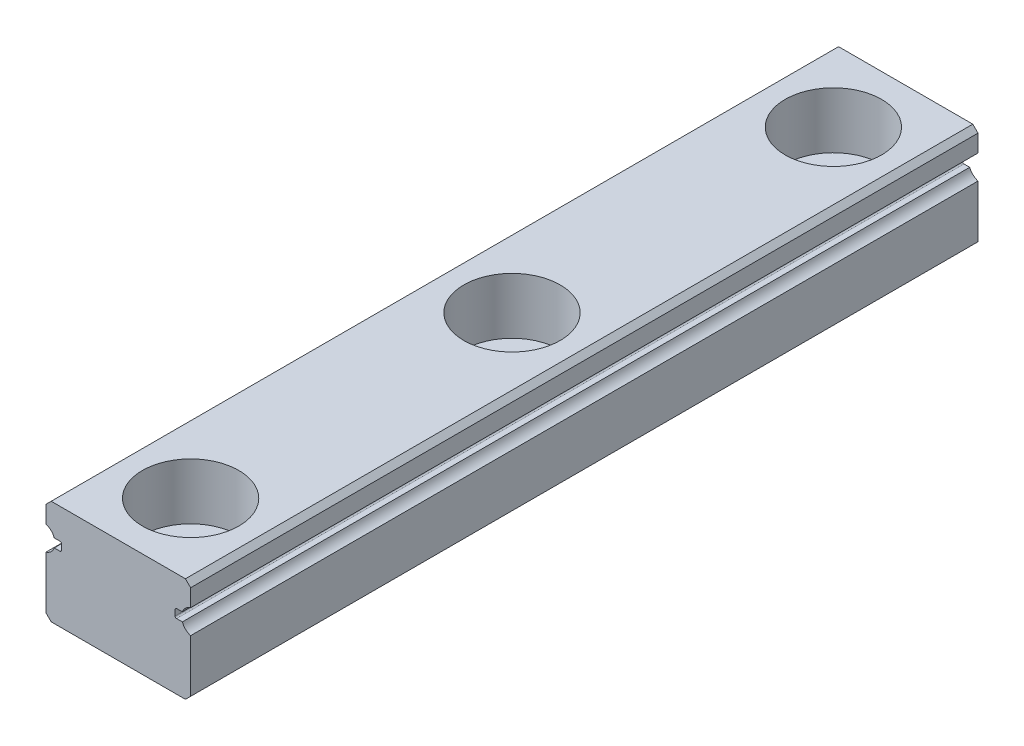
ISO-10303-21;
HEADER;
FILE_DESCRIPTION(('STEP AP214'),'2;1');
FILE_NAME('part.step','',(''),(''),'','','');
FILE_SCHEMA(('AUTOMOTIVE_DESIGN { 1 0 10303 214 1 1 1 1 }'));
ENDSEC;
DATA;
#1=APPLICATION_CONTEXT('core data for automotive mechanical design processes');
#2=APPLICATION_PROTOCOL_DEFINITION('international standard','automotive_design',2000,#1);
#3=PRODUCT_CONTEXT('',#1,'mechanical');
#4=PRODUCT('Part','Part','',(#3));
#5=PRODUCT_RELATED_PRODUCT_CATEGORY('part','',(#4));
#6=PRODUCT_DEFINITION_FORMATION('','',#4);
#7=PRODUCT_DEFINITION_CONTEXT('part definition',#1,'design');
#8=PRODUCT_DEFINITION('design','',#6,#7);
#9=PRODUCT_DEFINITION_SHAPE('','',#8);
#10=(LENGTH_UNIT() NAMED_UNIT(*) SI_UNIT(.MILLI.,.METRE.));
#11=(NAMED_UNIT(*) PLANE_ANGLE_UNIT() SI_UNIT($,.RADIAN.));
#12=(NAMED_UNIT(*) SI_UNIT($,.STERADIAN.) SOLID_ANGLE_UNIT());
#13=UNCERTAINTY_MEASURE_WITH_UNIT(LENGTH_MEASURE(1.E-05),#10,'distance_accuracy_value','');
#14=(GEOMETRIC_REPRESENTATION_CONTEXT(3) GLOBAL_UNCERTAINTY_ASSIGNED_CONTEXT((#13)) GLOBAL_UNIT_ASSIGNED_CONTEXT((#10,
#11,#12)) REPRESENTATION_CONTEXT('',''));
#15=CARTESIAN_POINT('',(0.,0.,0.));
#16=DIRECTION('',(0.,0.,1.));
#17=DIRECTION('',(1.,0.,0.));
#18=AXIS2_PLACEMENT_3D('',#15,#16,#17);
#19=CARTESIAN_POINT('',(4.5,3.9775,250.));
#20=DIRECTION('',(-0.707106781186546,-0.707106781186549,0.));
#21=DIRECTION('',(0.707106781186549,-0.707106781186546,0.));
#22=AXIS2_PLACEMENT_3D('',#19,#20,#21);
#23=PLANE('',#22);
#24=DIRECTION('',(-0.707106781186549,0.707106781186546,0.));
#25=VECTOR('',#24,1.);
#26=CARTESIAN_POINT('',(4.5,3.9775,244.5));
#27=LINE('',#26,#25);
#28=CARTESIAN_POINT('',(4.5,3.9775,244.5));
#29=VERTEX_POINT('',#28);
#30=CARTESIAN_POINT('',(4.1775,4.3,244.5));
#31=VERTEX_POINT('',#30);
#32=EDGE_CURVE('E206',#29,#31,#27,.T.);
#33=ORIENTED_EDGE('',*,*,#32,.F.);
#34=DIRECTION('',(0.,0.,-1.));
#35=VECTOR('',#34,1.);
#36=CARTESIAN_POINT('',(4.5,3.9775,250.));
#37=LINE('',#36,#35);
#38=CARTESIAN_POINT('',(4.5,3.9775,195.5));
#39=VERTEX_POINT('',#38);
#40=EDGE_CURVE('E67',#29,#39,#37,.T.);
#41=ORIENTED_EDGE('',*,*,#40,.T.);
#42=DIRECTION('',(-0.707106781186549,0.707106781186546,0.));
#43=VECTOR('',#42,1.);
#44=CARTESIAN_POINT('',(4.5,3.9775,195.5));
#45=LINE('',#44,#43);
#46=CARTESIAN_POINT('',(4.1775,4.3,195.5));
#47=VERTEX_POINT('',#46);
#48=EDGE_CURVE('E275',#39,#47,#45,.T.);
#49=ORIENTED_EDGE('',*,*,#48,.T.);
#50=DIRECTION('',(0.,0.,-1.));
#51=VECTOR('',#50,1.);
#52=CARTESIAN_POINT('',(4.1775,4.3,250.));
#53=LINE('',#52,#51);
#54=EDGE_CURVE('E52',#31,#47,#53,.T.);
#55=ORIENTED_EDGE('',*,*,#54,.F.);
#56=EDGE_LOOP('',(#33,#41,#49,#55));
#57=FACE_BOUND('',#56,.T.);
#58=ADVANCED_FACE('F45',(#57),#23,.F.);
#59=CARTESIAN_POINT('',(4.1775,4.3,250.));
#60=DIRECTION('',(0.,-1.,0.));
#61=DIRECTION('',(0.,0.,-1.));
#62=AXIS2_PLACEMENT_3D('',#59,#60,#61);
#63=PLANE('',#62);
#64=CARTESIAN_POINT('',(0.,4.3,240.));
#65=DIRECTION('',(0.,1.,0.));
#66=DIRECTION('',(0.,0.,1.));
#67=AXIS2_PLACEMENT_3D('',#64,#65,#66);
#68=CIRCLE('',#67,3.);
#69=CARTESIAN_POINT('',(0.,4.3,243.));
#70=VERTEX_POINT('',#69);
#71=EDGE_CURVE('E310',#70,#70,#68,.T.);
#72=ORIENTED_EDGE('',*,*,#71,.F.);
#73=EDGE_LOOP('',(#72));
#74=FACE_BOUND('',#73,.T.);
#75=CARTESIAN_POINT('',(0.,4.3,220.));
#76=DIRECTION('',(0.,1.,0.));
#77=DIRECTION('',(0.,0.,1.));
#78=AXIS2_PLACEMENT_3D('',#75,#76,#77);
#79=CIRCLE('',#78,3.);
#80=CARTESIAN_POINT('',(0.,4.3,223.));
#81=VERTEX_POINT('',#80);
#82=EDGE_CURVE('E298',#81,#81,#79,.T.);
#83=ORIENTED_EDGE('',*,*,#82,.F.);
#84=EDGE_LOOP('',(#83));
#85=FACE_BOUND('',#84,.T.);
#86=CARTESIAN_POINT('',(0.,4.3,200.));
#87=DIRECTION('',(0.,1.,0.));
#88=DIRECTION('',(0.,0.,1.));
#89=AXIS2_PLACEMENT_3D('',#86,#87,#88);
#90=CIRCLE('',#89,3.);
#91=CARTESIAN_POINT('',(0.,4.3,203.));
#92=VERTEX_POINT('',#91);
#93=EDGE_CURVE('E281',#92,#92,#90,.T.);
#94=ORIENTED_EDGE('',*,*,#93,.F.);
#95=EDGE_LOOP('',(#94));
#96=FACE_BOUND('',#95,.T.);
#97=DIRECTION('',(-1.,0.,0.));
#98=VECTOR('',#97,1.);
#99=CARTESIAN_POINT('',(4.1775,4.3,244.5));
#100=LINE('',#99,#98);
#101=CARTESIAN_POINT('',(-4.1775,4.3,244.5));
#102=VERTEX_POINT('',#101);
#103=EDGE_CURVE('E212',#31,#102,#100,.T.);
#104=ORIENTED_EDGE('',*,*,#103,.F.);
#105=ORIENTED_EDGE('',*,*,#54,.T.);
#106=DIRECTION('',(1.,0.,0.));
#107=VECTOR('',#106,1.);
#108=CARTESIAN_POINT('',(-75.9601602349209,4.3,195.5));
#109=LINE('',#108,#107);
#110=CARTESIAN_POINT('',(-4.1775,4.3,195.5));
#111=VERTEX_POINT('',#110);
#112=EDGE_CURVE('E271',#111,#47,#109,.T.);
#113=ORIENTED_EDGE('',*,*,#112,.F.);
#114=DIRECTION('',(0.,0.,-1.));
#115=VECTOR('',#114,1.);
#116=CARTESIAN_POINT('',(-4.1775,4.3,250.));
#117=LINE('',#116,#115);
#118=EDGE_CURVE('E265',#102,#111,#117,.T.);
#119=ORIENTED_EDGE('',*,*,#118,.F.);
#120=EDGE_LOOP('',(#104,#105,#113,#119));
#121=FACE_BOUND('',#120,.T.);
#122=ADVANCED_FACE('F269',(#74,#85,#96,#121),#63,.F.);
#123=CARTESIAN_POINT('',(-4.5,3.9775,250.));
#124=DIRECTION('',(0.707106781186546,-0.707106781186549,0.));
#125=DIRECTION('',(0.707106781186549,0.707106781186546,0.));
#126=AXIS2_PLACEMENT_3D('',#123,#124,#125);
#127=PLANE('',#126);
#128=DIRECTION('',(-0.707106781186549,-0.707106781186546,0.));
#129=VECTOR('',#128,1.);
#130=CARTESIAN_POINT('',(-4.1775,4.3,244.5));
#131=LINE('',#130,#129);
#132=CARTESIAN_POINT('',(-4.5,3.9775,244.5));
#133=VERTEX_POINT('',#132);
#134=EDGE_CURVE('E799',#102,#133,#131,.T.);
#135=ORIENTED_EDGE('',*,*,#134,.F.);
#136=ORIENTED_EDGE('',*,*,#118,.T.);
#137=DIRECTION('',(-0.707106781186549,-0.707106781186546,0.));
#138=VECTOR('',#137,1.);
#139=CARTESIAN_POINT('',(-4.5,3.9775,195.5));
#140=LINE('',#139,#138);
#141=CARTESIAN_POINT('',(-4.5,3.9775,195.5));
#142=VERTEX_POINT('',#141);
#143=EDGE_CURVE('E278',#111,#142,#140,.T.);
#144=ORIENTED_EDGE('',*,*,#143,.T.);
#145=DIRECTION('',(0.,0.,-1.));
#146=VECTOR('',#145,1.);
#147=CARTESIAN_POINT('',(-4.5,3.9775,250.));
#148=LINE('',#147,#146);
#149=EDGE_CURVE('E263',#133,#142,#148,.T.);
#150=ORIENTED_EDGE('',*,*,#149,.F.);
#151=EDGE_LOOP('',(#135,#136,#144,#150));
#152=FACE_BOUND('',#151,.T.);
#153=ADVANCED_FACE('F335',(#152),#127,.F.);
#154=CARTESIAN_POINT('',(-4.5,2.90375,250.));
#155=DIRECTION('',(1.,0.,0.));
#156=DIRECTION('',(0.,0.,-1.));
#157=AXIS2_PLACEMENT_3D('',#154,#155,#156);
#158=PLANE('',#157);
#159=DIRECTION('',(0.,-1.,0.));
#160=VECTOR('',#159,1.);
#161=CARTESIAN_POINT('',(-4.5,3.9775,244.5));
#162=LINE('',#161,#160);
#163=CARTESIAN_POINT('',(-4.5,2.90375,244.5));
#164=VERTEX_POINT('',#163);
#165=EDGE_CURVE('E800',#133,#164,#162,.T.);
#166=ORIENTED_EDGE('',*,*,#165,.F.);
#167=ORIENTED_EDGE('',*,*,#149,.T.);
#168=DIRECTION('',(0.,-1.,0.));
#169=VECTOR('',#168,1.);
#170=CARTESIAN_POINT('',(-4.5,2.90375,195.5));
#171=LINE('',#170,#169);
#172=CARTESIAN_POINT('',(-4.5,2.90375,195.5));
#173=VERTEX_POINT('',#172);
#174=EDGE_CURVE('E286',#142,#173,#171,.T.);
#175=ORIENTED_EDGE('',*,*,#174,.T.);
#176=DIRECTION('',(0.,0.,-1.));
#177=VECTOR('',#176,1.);
#178=CARTESIAN_POINT('',(-4.5,2.90375,250.));
#179=LINE('',#178,#177);
#180=EDGE_CURVE('E261',#164,#173,#179,.T.);
#181=ORIENTED_EDGE('',*,*,#180,.F.);
#182=EDGE_LOOP('',(#166,#167,#175,#181));
#183=FACE_BOUND('',#182,.T.);
#184=ADVANCED_FACE('F367',(#183),#158,.F.);
#185=CARTESIAN_POINT('',(-4.725,2.15,250.));
#186=DIRECTION('',(0.,0.,-1.));
#187=DIRECTION('',(-1.,0.,0.));
#188=AXIS2_PLACEMENT_3D('',#185,#186,#187);
#189=CYLINDRICAL_SURFACE('',#188,0.786615574788601);
#190=CARTESIAN_POINT('',(-4.725,2.15,244.5));
#191=DIRECTION('',(0.,0.,-1.));
#192=DIRECTION('',(1.,0.,0.));
#193=AXIS2_PLACEMENT_3D('',#190,#191,#192);
#194=CIRCLE('',#193,0.786615574788601);
#195=CARTESIAN_POINT('',(-3.98617386179156,2.42,244.5));
#196=VERTEX_POINT('',#195);
#197=EDGE_CURVE('E802',#164,#196,#194,.T.);
#198=ORIENTED_EDGE('',*,*,#197,.F.);
#199=ORIENTED_EDGE('',*,*,#180,.T.);
#200=CARTESIAN_POINT('',(-4.725,2.15,195.5));
#201=DIRECTION('',(0.,0.,1.));
#202=DIRECTION('',(1.,0.,0.));
#203=AXIS2_PLACEMENT_3D('',#200,#201,#202);
#204=CIRCLE('',#203,0.786615574788601);
#205=CARTESIAN_POINT('',(-3.98617386179156,2.42,195.5));
#206=VERTEX_POINT('',#205);
#207=EDGE_CURVE('E790',#173,#206,#204,.F.);
#208=ORIENTED_EDGE('',*,*,#207,.T.);
#209=DIRECTION('',(0.,0.,-1.));
#210=VECTOR('',#209,1.);
#211=CARTESIAN_POINT('',(-3.98617386179156,2.42,250.));
#212=LINE('',#211,#210);
#213=EDGE_CURVE('E259',#196,#206,#212,.T.);
#214=ORIENTED_EDGE('',*,*,#213,.F.);
#215=EDGE_LOOP('',(#198,#199,#208,#214));
#216=FACE_BOUND('',#215,.T.);
#217=ADVANCED_FACE('F375',(#216),#189,.F.);
#218=CARTESIAN_POINT('',(-3.98617386179156,2.42,250.));
#219=DIRECTION('',(0.,1.,0.));
#220=DIRECTION('',(0.,0.,1.));
#221=AXIS2_PLACEMENT_3D('',#218,#219,#220);
#222=PLANE('',#221);
#223=DIRECTION('',(1.,0.,0.));
#224=VECTOR('',#223,1.);
#225=CARTESIAN_POINT('',(-3.98617386179156,2.42,244.5));
#226=LINE('',#225,#224);
#227=CARTESIAN_POINT('',(-3.62617386179156,2.42,244.5));
#228=VERTEX_POINT('',#227);
#229=EDGE_CURVE('E807',#196,#228,#226,.T.);
#230=ORIENTED_EDGE('',*,*,#229,.F.);
#231=ORIENTED_EDGE('',*,*,#213,.T.);
#232=DIRECTION('',(1.,0.,0.));
#233=VECTOR('',#232,1.);
#234=CARTESIAN_POINT('',(-3.98617386179156,2.42,195.5));
#235=LINE('',#234,#233);
#236=CARTESIAN_POINT('',(-3.62617386179156,2.42,195.5));
#237=VERTEX_POINT('',#236);
#238=EDGE_CURVE('E787',#206,#237,#235,.T.);
#239=ORIENTED_EDGE('',*,*,#238,.T.);
#240=DIRECTION('',(0.,0.,-1.));
#241=VECTOR('',#240,1.);
#242=CARTESIAN_POINT('',(-3.62617386179156,2.42,250.));
#243=LINE('',#242,#241);
#244=EDGE_CURVE('E257',#228,#237,#243,.T.);
#245=ORIENTED_EDGE('',*,*,#244,.F.);
#246=EDGE_LOOP('',(#230,#231,#239,#245));
#247=FACE_BOUND('',#246,.T.);
#248=ADVANCED_FACE('F383',(#247),#222,.F.);
#249=CARTESIAN_POINT('',(-3.62617386179156,2.33,250.));
#250=DIRECTION('',(0.,0.,-1.));
#251=DIRECTION('',(-1.,0.,0.));
#252=AXIS2_PLACEMENT_3D('',#249,#250,#251);
#253=CYLINDRICAL_SURFACE('',#252,0.0900000000000002);
#254=CARTESIAN_POINT('',(-3.62617386179156,2.33,244.5));
#255=DIRECTION('',(0.,0.,-1.));
#256=DIRECTION('',(1.,0.,0.));
#257=AXIS2_PLACEMENT_3D('',#254,#255,#256);
#258=CIRCLE('',#257,0.0900000000000002);
#259=CARTESIAN_POINT('',(-3.53617386179156,2.33,244.5));
#260=VERTEX_POINT('',#259);
#261=EDGE_CURVE('E809',#228,#260,#258,.T.);
#262=ORIENTED_EDGE('',*,*,#261,.F.);
#263=ORIENTED_EDGE('',*,*,#244,.T.);
#264=CARTESIAN_POINT('',(-3.62617386179156,2.33,195.5));
#265=DIRECTION('',(0.,0.,1.));
#266=DIRECTION('',(1.,0.,0.));
#267=AXIS2_PLACEMENT_3D('',#264,#265,#266);
#268=CIRCLE('',#267,0.0900000000000002);
#269=CARTESIAN_POINT('',(-3.53617386179156,2.33,195.5));
#270=VERTEX_POINT('',#269);
#271=EDGE_CURVE('E784',#237,#270,#268,.F.);
#272=ORIENTED_EDGE('',*,*,#271,.T.);
#273=DIRECTION('',(0.,0.,-1.));
#274=VECTOR('',#273,1.);
#275=CARTESIAN_POINT('',(-3.53617386179156,2.33,250.));
#276=LINE('',#275,#274);
#277=EDGE_CURVE('E255',#260,#270,#276,.T.);
#278=ORIENTED_EDGE('',*,*,#277,.F.);
#279=EDGE_LOOP('',(#262,#263,#272,#278));
#280=FACE_BOUND('',#279,.T.);
#281=ADVANCED_FACE('F391',(#280),#253,.F.);
#282=CARTESIAN_POINT('',(-3.53617386179156,2.33,250.));
#283=DIRECTION('',(1.,0.,0.));
#284=DIRECTION('',(0.,0.,-1.));
#285=AXIS2_PLACEMENT_3D('',#282,#283,#284);
#286=PLANE('',#285);
#287=DIRECTION('',(0.,-1.,0.));
#288=VECTOR('',#287,1.);
#289=CARTESIAN_POINT('',(-3.53617386179156,2.33,244.5));
#290=LINE('',#289,#288);
#291=CARTESIAN_POINT('',(-3.53617386179156,1.97,244.5));
#292=VERTEX_POINT('',#291);
#293=EDGE_CURVE('E811',#260,#292,#290,.T.);
#294=ORIENTED_EDGE('',*,*,#293,.F.);
#295=ORIENTED_EDGE('',*,*,#277,.T.);
#296=DIRECTION('',(0.,-1.,0.));
#297=VECTOR('',#296,1.);
#298=CARTESIAN_POINT('',(-3.53617386179156,2.33,195.5));
#299=LINE('',#298,#297);
#300=CARTESIAN_POINT('',(-3.53617386179156,1.97,195.5));
#301=VERTEX_POINT('',#300);
#302=EDGE_CURVE('E781',#270,#301,#299,.T.);
#303=ORIENTED_EDGE('',*,*,#302,.T.);
#304=DIRECTION('',(0.,0.,-1.));
#305=VECTOR('',#304,1.);
#306=CARTESIAN_POINT('',(-3.53617386179156,1.97,250.));
#307=LINE('',#306,#305);
#308=EDGE_CURVE('E253',#292,#301,#307,.T.);
#309=ORIENTED_EDGE('',*,*,#308,.F.);
#310=EDGE_LOOP('',(#294,#295,#303,#309));
#311=FACE_BOUND('',#310,.T.);
#312=ADVANCED_FACE('F399',(#311),#286,.F.);
#313=CARTESIAN_POINT('',(-3.62617386179156,1.97,250.));
#314=DIRECTION('',(0.,0.,-1.));
#315=DIRECTION('',(-1.,0.,0.));
#316=AXIS2_PLACEMENT_3D('',#313,#314,#315);
#317=CYLINDRICAL_SURFACE('',#316,0.0900000000000001);
#318=CARTESIAN_POINT('',(-3.62617386179156,1.97,244.5));
#319=DIRECTION('',(0.,0.,-1.));
#320=DIRECTION('',(1.,0.,0.));
#321=AXIS2_PLACEMENT_3D('',#318,#319,#320);
#322=CIRCLE('',#321,0.0900000000000002);
#323=CARTESIAN_POINT('',(-3.62617386179156,1.88,244.5));
#324=VERTEX_POINT('',#323);
#325=EDGE_CURVE('E813',#292,#324,#322,.T.);
#326=ORIENTED_EDGE('',*,*,#325,.F.);
#327=ORIENTED_EDGE('',*,*,#308,.T.);
#328=CARTESIAN_POINT('',(-3.62617386179156,1.97,195.5));
#329=DIRECTION('',(0.,0.,1.));
#330=DIRECTION('',(1.,0.,0.));
#331=AXIS2_PLACEMENT_3D('',#328,#329,#330);
#332=CIRCLE('',#331,0.0900000000000001);
#333=CARTESIAN_POINT('',(-3.62617386179156,1.88,195.5));
#334=VERTEX_POINT('',#333);
#335=EDGE_CURVE('E778',#301,#334,#332,.F.);
#336=ORIENTED_EDGE('',*,*,#335,.T.);
#337=DIRECTION('',(0.,0.,-1.));
#338=VECTOR('',#337,1.);
#339=CARTESIAN_POINT('',(-3.62617386179156,1.88,250.));
#340=LINE('',#339,#338);
#341=EDGE_CURVE('E251',#324,#334,#340,.T.);
#342=ORIENTED_EDGE('',*,*,#341,.F.);
#343=EDGE_LOOP('',(#326,#327,#336,#342));
#344=FACE_BOUND('',#343,.T.);
#345=ADVANCED_FACE('F407',(#344),#317,.F.);
#346=CARTESIAN_POINT('',(-3.98617386179156,1.88,250.));
#347=DIRECTION('',(0.,-1.,0.));
#348=DIRECTION('',(1.,0.,0.));
#349=AXIS2_PLACEMENT_3D('',#346,#347,#348);
#350=PLANE('',#349);
#351=DIRECTION('',(-1.,0.,0.));
#352=VECTOR('',#351,1.);
#353=CARTESIAN_POINT('',(-3.62617386179156,1.88,244.5));
#354=LINE('',#353,#352);
#355=CARTESIAN_POINT('',(-3.98617386179156,1.88,244.5));
#356=VERTEX_POINT('',#355);
#357=EDGE_CURVE('E815',#324,#356,#354,.T.);
#358=ORIENTED_EDGE('',*,*,#357,.F.);
#359=ORIENTED_EDGE('',*,*,#341,.T.);
#360=DIRECTION('',(-1.,0.,0.));
#361=VECTOR('',#360,1.);
#362=CARTESIAN_POINT('',(-3.98617386179156,1.88,195.5));
#363=LINE('',#362,#361);
#364=CARTESIAN_POINT('',(-3.98617386179156,1.88,195.5));
#365=VERTEX_POINT('',#364);
#366=EDGE_CURVE('E775',#334,#365,#363,.T.);
#367=ORIENTED_EDGE('',*,*,#366,.T.);
#368=DIRECTION('',(0.,0.,-1.));
#369=VECTOR('',#368,1.);
#370=CARTESIAN_POINT('',(-3.98617386179156,1.88,250.));
#371=LINE('',#370,#369);
#372=EDGE_CURVE('E249',#356,#365,#371,.T.);
#373=ORIENTED_EDGE('',*,*,#372,.F.);
#374=EDGE_LOOP('',(#358,#359,#367,#373));
#375=FACE_BOUND('',#374,.T.);
#376=ADVANCED_FACE('F415',(#375),#350,.F.);
#377=CARTESIAN_POINT('',(-4.725,2.15,250.));
#378=DIRECTION('',(0.,0.,-1.));
#379=DIRECTION('',(-1.,0.,0.));
#380=AXIS2_PLACEMENT_3D('',#377,#378,#379);
#381=CYLINDRICAL_SURFACE('',#380,0.7866155747886);
#382=CARTESIAN_POINT('',(-4.725,2.15,244.5));
#383=DIRECTION('',(0.,0.,-1.));
#384=DIRECTION('',(1.,0.,0.));
#385=AXIS2_PLACEMENT_3D('',#382,#383,#384);
#386=CIRCLE('',#385,0.786615574788601);
#387=CARTESIAN_POINT('',(-4.5,1.39625,244.5));
#388=VERTEX_POINT('',#387);
#389=EDGE_CURVE('E817',#356,#388,#386,.T.);
#390=ORIENTED_EDGE('',*,*,#389,.F.);
#391=ORIENTED_EDGE('',*,*,#372,.T.);
#392=CARTESIAN_POINT('',(-4.725,2.15,195.5));
#393=DIRECTION('',(0.,0.,1.));
#394=DIRECTION('',(1.,0.,0.));
#395=AXIS2_PLACEMENT_3D('',#392,#393,#394);
#396=CIRCLE('',#395,0.7866155747886);
#397=CARTESIAN_POINT('',(-4.5,1.39625,195.5));
#398=VERTEX_POINT('',#397);
#399=EDGE_CURVE('E767',#365,#398,#396,.F.);
#400=ORIENTED_EDGE('',*,*,#399,.T.);
#401=DIRECTION('',(0.,0.,-1.));
#402=VECTOR('',#401,1.);
#403=CARTESIAN_POINT('',(-4.5,1.39625,250.));
#404=LINE('',#403,#402);
#405=EDGE_CURVE('E247',#388,#398,#404,.T.);
#406=ORIENTED_EDGE('',*,*,#405,.F.);
#407=EDGE_LOOP('',(#390,#391,#400,#406));
#408=FACE_BOUND('',#407,.T.);
#409=ADVANCED_FACE('F423',(#408),#381,.F.);
#410=CARTESIAN_POINT('',(-4.5,-1.8775,250.));
#411=DIRECTION('',(1.,0.,0.));
#412=DIRECTION('',(0.,0.,-1.));
#413=AXIS2_PLACEMENT_3D('',#410,#411,#412);
#414=PLANE('',#413);
#415=DIRECTION('',(0.,-1.,0.));
#416=VECTOR('',#415,1.);
#417=CARTESIAN_POINT('',(-4.5,1.39625,244.5));
#418=LINE('',#417,#416);
#419=CARTESIAN_POINT('',(-4.5,-1.8775,244.5));
#420=VERTEX_POINT('',#419);
#421=EDGE_CURVE('E819',#388,#420,#418,.T.);
#422=ORIENTED_EDGE('',*,*,#421,.F.);
#423=ORIENTED_EDGE('',*,*,#405,.T.);
#424=DIRECTION('',(0.,-1.,0.));
#425=VECTOR('',#424,1.);
#426=CARTESIAN_POINT('',(-4.5,-1.8775,195.5));
#427=LINE('',#426,#425);
#428=CARTESIAN_POINT('',(-4.5,-1.8775,195.5));
#429=VERTEX_POINT('',#428);
#430=EDGE_CURVE('E764',#398,#429,#427,.T.);
#431=ORIENTED_EDGE('',*,*,#430,.T.);
#432=DIRECTION('',(0.,0.,-1.));
#433=VECTOR('',#432,1.);
#434=CARTESIAN_POINT('',(-4.5,-1.8775,250.));
#435=LINE('',#434,#433);
#436=EDGE_CURVE('E245',#420,#429,#435,.T.);
#437=ORIENTED_EDGE('',*,*,#436,.F.);
#438=EDGE_LOOP('',(#422,#423,#431,#437));
#439=FACE_BOUND('',#438,.T.);
#440=ADVANCED_FACE('F431',(#439),#414,.F.);
#441=CARTESIAN_POINT('',(-4.1775,-2.2,250.));
#442=DIRECTION('',(0.707106781186549,0.707106781186546,0.));
#443=DIRECTION('',(-0.707106781186546,0.707106781186549,0.));
#444=AXIS2_PLACEMENT_3D('',#441,#442,#443);
#445=PLANE('',#444);
#446=DIRECTION('',(0.707106781186546,-0.707106781186549,0.));
#447=VECTOR('',#446,1.);
#448=CARTESIAN_POINT('',(-4.5,-1.8775,244.5));
#449=LINE('',#448,#447);
#450=CARTESIAN_POINT('',(-4.1775,-2.2,244.5));
#451=VERTEX_POINT('',#450);
#452=EDGE_CURVE('E755',#420,#451,#449,.T.);
#453=ORIENTED_EDGE('',*,*,#452,.F.);
#454=ORIENTED_EDGE('',*,*,#436,.T.);
#455=DIRECTION('',(0.707106781186546,-0.707106781186549,0.));
#456=VECTOR('',#455,1.);
#457=CARTESIAN_POINT('',(-4.1775,-2.2,195.5));
#458=LINE('',#457,#456);
#459=CARTESIAN_POINT('',(-4.1775,-2.2,195.5));
#460=VERTEX_POINT('',#459);
#461=EDGE_CURVE('E761',#429,#460,#458,.T.);
#462=ORIENTED_EDGE('',*,*,#461,.T.);
#463=DIRECTION('',(0.,0.,-1.));
#464=VECTOR('',#463,1.);
#465=CARTESIAN_POINT('',(-4.1775,-2.2,250.));
#466=LINE('',#465,#464);
#467=EDGE_CURVE('E243',#451,#460,#466,.T.);
#468=ORIENTED_EDGE('',*,*,#467,.F.);
#469=EDGE_LOOP('',(#453,#454,#462,#468));
#470=FACE_BOUND('',#469,.T.);
#471=ADVANCED_FACE('F439',(#470),#445,.F.);
#472=CARTESIAN_POINT('',(-4.1775,-2.2,250.));
#473=DIRECTION('',(0.,1.,0.));
#474=DIRECTION('',(0.,0.,1.));
#475=AXIS2_PLACEMENT_3D('',#472,#473,#474);
#476=PLANE('',#475);
#477=CARTESIAN_POINT('',(0.,-2.2,240.));
#478=DIRECTION('',(0.,1.,0.));
#479=DIRECTION('',(0.,0.,1.));
#480=AXIS2_PLACEMENT_3D('',#477,#478,#479);
#481=CIRCLE('',#480,1.75);
#482=CARTESIAN_POINT('',(0.,-2.2,241.75));
#483=VERTEX_POINT('',#482);
#484=EDGE_CURVE('E217',#483,#483,#481,.T.);
#485=ORIENTED_EDGE('',*,*,#484,.T.);
#486=EDGE_LOOP('',(#485));
#487=FACE_BOUND('',#486,.T.);
#488=CARTESIAN_POINT('',(0.,-2.2,220.));
#489=DIRECTION('',(0.,1.,0.));
#490=DIRECTION('',(0.,0.,1.));
#491=AXIS2_PLACEMENT_3D('',#488,#489,#490);
#492=CIRCLE('',#491,1.75);
#493=CARTESIAN_POINT('',(0.,-2.2,221.75));
#494=VERTEX_POINT('',#493);
#495=EDGE_CURVE('E307',#494,#494,#492,.T.);
#496=ORIENTED_EDGE('',*,*,#495,.T.);
#497=EDGE_LOOP('',(#496));
#498=FACE_BOUND('',#497,.T.);
#499=CARTESIAN_POINT('',(0.,-2.2,200.));
#500=DIRECTION('',(0.,1.,0.));
#501=DIRECTION('',(0.,0.,1.));
#502=AXIS2_PLACEMENT_3D('',#499,#500,#501);
#503=CIRCLE('',#502,1.75);
#504=CARTESIAN_POINT('',(0.,-2.2,201.75));
#505=VERTEX_POINT('',#504);
#506=EDGE_CURVE('E295',#505,#505,#503,.T.);
#507=ORIENTED_EDGE('',*,*,#506,.T.);
#508=EDGE_LOOP('',(#507));
#509=FACE_BOUND('',#508,.T.);
#510=DIRECTION('',(1.,0.,0.));
#511=VECTOR('',#510,1.);
#512=CARTESIAN_POINT('',(-4.1775,-2.2,244.5));
#513=LINE('',#512,#511);
#514=CARTESIAN_POINT('',(4.1775,-2.2,244.5));
#515=VERTEX_POINT('',#514);
#516=EDGE_CURVE('E749',#451,#515,#513,.T.);
#517=ORIENTED_EDGE('',*,*,#516,.F.);
#518=ORIENTED_EDGE('',*,*,#467,.T.);
#519=DIRECTION('',(1.,0.,0.));
#520=VECTOR('',#519,1.);
#521=CARTESIAN_POINT('',(-4.1775,-2.2,195.5));
#522=LINE('',#521,#520);
#523=CARTESIAN_POINT('',(4.1775,-2.2,195.5));
#524=VERTEX_POINT('',#523);
#525=EDGE_CURVE('E765',#460,#524,#522,.T.);
#526=ORIENTED_EDGE('',*,*,#525,.T.);
#527=DIRECTION('',(0.,0.,-1.));
#528=VECTOR('',#527,1.);
#529=CARTESIAN_POINT('',(4.1775,-2.2,250.));
#530=LINE('',#529,#528);
#531=EDGE_CURVE('E241',#515,#524,#530,.T.);
#532=ORIENTED_EDGE('',*,*,#531,.F.);
#533=EDGE_LOOP('',(#517,#518,#526,#532));
#534=FACE_BOUND('',#533,.T.);
#535=ADVANCED_FACE('F447',(#487,#498,#509,#534),#476,.F.);
#536=CARTESIAN_POINT('',(4.1775,-2.2,250.));
#537=DIRECTION('',(-0.707106781186549,0.707106781186546,0.));
#538=DIRECTION('',(-0.707106781186546,-0.707106781186549,0.));
#539=AXIS2_PLACEMENT_3D('',#536,#537,#538);
#540=PLANE('',#539);
#541=DIRECTION('',(0.707106781186546,0.707106781186549,0.));
#542=VECTOR('',#541,1.);
#543=CARTESIAN_POINT('',(4.1775,-2.2,244.5));
#544=LINE('',#543,#542);
#545=CARTESIAN_POINT('',(4.5,-1.8775,244.5));
#546=VERTEX_POINT('',#545);
#547=EDGE_CURVE('E754',#515,#546,#544,.T.);
#548=ORIENTED_EDGE('',*,*,#547,.F.);
#549=ORIENTED_EDGE('',*,*,#531,.T.);
#550=DIRECTION('',(0.707106781186546,0.707106781186549,0.));
#551=VECTOR('',#550,1.);
#552=CARTESIAN_POINT('',(4.1775,-2.2,195.5));
#553=LINE('',#552,#551);
#554=CARTESIAN_POINT('',(4.5,-1.8775,195.5));
#555=VERTEX_POINT('',#554);
#556=EDGE_CURVE('E769',#524,#555,#553,.T.);
#557=ORIENTED_EDGE('',*,*,#556,.T.);
#558=DIRECTION('',(0.,0.,-1.));
#559=VECTOR('',#558,1.);
#560=CARTESIAN_POINT('',(4.5,-1.8775,250.));
#561=LINE('',#560,#559);
#562=EDGE_CURVE('E239',#546,#555,#561,.T.);
#563=ORIENTED_EDGE('',*,*,#562,.F.);
#564=EDGE_LOOP('',(#548,#549,#557,#563));
#565=FACE_BOUND('',#564,.T.);
#566=ADVANCED_FACE('F455',(#565),#540,.F.);
#567=CARTESIAN_POINT('',(4.5,-1.8775,250.));
#568=DIRECTION('',(-1.,0.,0.));
#569=DIRECTION('',(0.,0.,1.));
#570=AXIS2_PLACEMENT_3D('',#567,#568,#569);
#571=PLANE('',#570);
#572=DIRECTION('',(0.,1.,0.));
#573=VECTOR('',#572,1.);
#574=CARTESIAN_POINT('',(4.5,-1.8775,244.5));
#575=LINE('',#574,#573);
#576=CARTESIAN_POINT('',(4.5,1.39625,244.5));
#577=VERTEX_POINT('',#576);
#578=EDGE_CURVE('E823',#546,#577,#575,.T.);
#579=ORIENTED_EDGE('',*,*,#578,.F.);
#580=ORIENTED_EDGE('',*,*,#562,.T.);
#581=DIRECTION('',(0.,1.,0.));
#582=VECTOR('',#581,1.);
#583=CARTESIAN_POINT('',(4.5,-1.8775,195.5));
#584=LINE('',#583,#582);
#585=CARTESIAN_POINT('',(4.5,1.39625,195.5));
#586=VERTEX_POINT('',#585);
#587=EDGE_CURVE('E858',#555,#586,#584,.T.);
#588=ORIENTED_EDGE('',*,*,#587,.T.);
#589=DIRECTION('',(0.,0.,-1.));
#590=VECTOR('',#589,1.);
#591=CARTESIAN_POINT('',(4.5,1.39625,250.));
#592=LINE('',#591,#590);
#593=EDGE_CURVE('E237',#577,#586,#592,.T.);
#594=ORIENTED_EDGE('',*,*,#593,.F.);
#595=EDGE_LOOP('',(#579,#580,#588,#594));
#596=FACE_BOUND('',#595,.T.);
#597=ADVANCED_FACE('F463',(#596),#571,.F.);
#598=CARTESIAN_POINT('',(4.725,2.15,250.));
#599=DIRECTION('',(0.,0.,-1.));
#600=DIRECTION('',(-1.,0.,0.));
#601=AXIS2_PLACEMENT_3D('',#598,#599,#600);
#602=CYLINDRICAL_SURFACE('',#601,0.7866155747886);
#603=CARTESIAN_POINT('',(4.725,2.15,244.5));
#604=DIRECTION('',(0.,0.,-1.));
#605=DIRECTION('',(1.,0.,0.));
#606=AXIS2_PLACEMENT_3D('',#603,#604,#605);
#607=CIRCLE('',#606,0.7866155747886);
#608=CARTESIAN_POINT('',(3.98617386179156,1.88,244.5));
#609=VERTEX_POINT('',#608);
#610=EDGE_CURVE('E825',#577,#609,#607,.T.);
#611=ORIENTED_EDGE('',*,*,#610,.F.);
#612=ORIENTED_EDGE('',*,*,#593,.T.);
#613=CARTESIAN_POINT('',(4.725,2.15,195.5));
#614=DIRECTION('',(0.,0.,1.));
#615=DIRECTION('',(1.,0.,0.));
#616=AXIS2_PLACEMENT_3D('',#613,#614,#615);
#617=CIRCLE('',#616,0.7866155747886);
#618=CARTESIAN_POINT('',(3.98617386179156,1.88,195.5));
#619=VERTEX_POINT('',#618);
#620=EDGE_CURVE('E855',#586,#619,#617,.F.);
#621=ORIENTED_EDGE('',*,*,#620,.T.);
#622=DIRECTION('',(0.,0.,-1.));
#623=VECTOR('',#622,1.);
#624=CARTESIAN_POINT('',(3.98617386179156,1.88,250.));
#625=LINE('',#624,#623);
#626=EDGE_CURVE('E235',#609,#619,#625,.T.);
#627=ORIENTED_EDGE('',*,*,#626,.F.);
#628=EDGE_LOOP('',(#611,#612,#621,#627));
#629=FACE_BOUND('',#628,.T.);
#630=ADVANCED_FACE('F471',(#629),#602,.F.);
#631=CARTESIAN_POINT('',(3.98617386179156,1.88,250.));
#632=DIRECTION('',(0.,-1.,0.));
#633=DIRECTION('',(1.,0.,0.));
#634=AXIS2_PLACEMENT_3D('',#631,#632,#633);
#635=PLANE('',#634);
#636=DIRECTION('',(-1.,0.,0.));
#637=VECTOR('',#636,1.);
#638=CARTESIAN_POINT('',(3.98617386179156,1.88,244.5));
#639=LINE('',#638,#637);
#640=CARTESIAN_POINT('',(3.62617386179156,1.88,244.5));
#641=VERTEX_POINT('',#640);
#642=EDGE_CURVE('E827',#609,#641,#639,.T.);
#643=ORIENTED_EDGE('',*,*,#642,.F.);
#644=ORIENTED_EDGE('',*,*,#626,.T.);
#645=DIRECTION('',(-1.,0.,0.));
#646=VECTOR('',#645,1.);
#647=CARTESIAN_POINT('',(3.98617386179156,1.88,195.5));
#648=LINE('',#647,#646);
#649=CARTESIAN_POINT('',(3.62617386179156,1.88,195.5));
#650=VERTEX_POINT('',#649);
#651=EDGE_CURVE('E852',#619,#650,#648,.T.);
#652=ORIENTED_EDGE('',*,*,#651,.T.);
#653=DIRECTION('',(0.,0.,-1.));
#654=VECTOR('',#653,1.);
#655=CARTESIAN_POINT('',(3.62617386179156,1.88,250.));
#656=LINE('',#655,#654);
#657=EDGE_CURVE('E233',#641,#650,#656,.T.);
#658=ORIENTED_EDGE('',*,*,#657,.F.);
#659=EDGE_LOOP('',(#643,#644,#652,#658));
#660=FACE_BOUND('',#659,.T.);
#661=ADVANCED_FACE('F479',(#660),#635,.F.);
#662=CARTESIAN_POINT('',(3.62617386179156,1.97,250.));
#663=DIRECTION('',(0.,0.,-1.));
#664=DIRECTION('',(-1.,0.,0.));
#665=AXIS2_PLACEMENT_3D('',#662,#663,#664);
#666=CYLINDRICAL_SURFACE('',#665,0.0899999999999998);
#667=CARTESIAN_POINT('',(3.62617386179156,1.97,244.5));
#668=DIRECTION('',(0.,0.,-1.));
#669=DIRECTION('',(1.,0.,0.));
#670=AXIS2_PLACEMENT_3D('',#667,#668,#669);
#671=CIRCLE('',#670,0.0899999999999998);
#672=CARTESIAN_POINT('',(3.53617386179156,1.97,244.5));
#673=VERTEX_POINT('',#672);
#674=EDGE_CURVE('E829',#641,#673,#671,.T.);
#675=ORIENTED_EDGE('',*,*,#674,.F.);
#676=ORIENTED_EDGE('',*,*,#657,.T.);
#677=CARTESIAN_POINT('',(3.62617386179156,1.97,195.5));
#678=DIRECTION('',(0.,0.,1.));
#679=DIRECTION('',(1.,0.,0.));
#680=AXIS2_PLACEMENT_3D('',#677,#678,#679);
#681=CIRCLE('',#680,0.0899999999999998);
#682=CARTESIAN_POINT('',(3.53617386179156,1.97,195.5));
#683=VERTEX_POINT('',#682);
#684=EDGE_CURVE('E849',#650,#683,#681,.F.);
#685=ORIENTED_EDGE('',*,*,#684,.T.);
#686=DIRECTION('',(0.,0.,-1.));
#687=VECTOR('',#686,1.);
#688=CARTESIAN_POINT('',(3.53617386179156,1.97,250.));
#689=LINE('',#688,#687);
#690=EDGE_CURVE('E231',#673,#683,#689,.T.);
#691=ORIENTED_EDGE('',*,*,#690,.F.);
#692=EDGE_LOOP('',(#675,#676,#685,#691));
#693=FACE_BOUND('',#692,.T.);
#694=ADVANCED_FACE('F487',(#693),#666,.F.);
#695=CARTESIAN_POINT('',(3.53617386179156,2.33,250.));
#696=DIRECTION('',(-1.,0.,0.));
#697=DIRECTION('',(0.,0.,1.));
#698=AXIS2_PLACEMENT_3D('',#695,#696,#697);
#699=PLANE('',#698);
#700=DIRECTION('',(0.,1.,0.));
#701=VECTOR('',#700,1.);
#702=CARTESIAN_POINT('',(3.53617386179156,1.97,244.5));
#703=LINE('',#702,#701);
#704=CARTESIAN_POINT('',(3.53617386179156,2.33,244.5));
#705=VERTEX_POINT('',#704);
#706=EDGE_CURVE('E831',#673,#705,#703,.T.);
#707=ORIENTED_EDGE('',*,*,#706,.F.);
#708=ORIENTED_EDGE('',*,*,#690,.T.);
#709=DIRECTION('',(0.,1.,0.));
#710=VECTOR('',#709,1.);
#711=CARTESIAN_POINT('',(3.53617386179156,2.33,195.5));
#712=LINE('',#711,#710);
#713=CARTESIAN_POINT('',(3.53617386179156,2.33,195.5));
#714=VERTEX_POINT('',#713);
#715=EDGE_CURVE('E846',#683,#714,#712,.T.);
#716=ORIENTED_EDGE('',*,*,#715,.T.);
#717=DIRECTION('',(0.,0.,-1.));
#718=VECTOR('',#717,1.);
#719=CARTESIAN_POINT('',(3.53617386179156,2.33,250.));
#720=LINE('',#719,#718);
#721=EDGE_CURVE('E229',#705,#714,#720,.T.);
#722=ORIENTED_EDGE('',*,*,#721,.F.);
#723=EDGE_LOOP('',(#707,#708,#716,#722));
#724=FACE_BOUND('',#723,.T.);
#725=ADVANCED_FACE('F495',(#724),#699,.F.);
#726=CARTESIAN_POINT('',(3.62617386179156,2.33,250.));
#727=DIRECTION('',(0.,0.,-1.));
#728=DIRECTION('',(-1.,0.,0.));
#729=AXIS2_PLACEMENT_3D('',#726,#727,#728);
#730=CYLINDRICAL_SURFACE('',#729,0.0900000000000007);
#731=CARTESIAN_POINT('',(3.62617386179156,2.33,244.5));
#732=DIRECTION('',(0.,0.,-1.));
#733=DIRECTION('',(1.,0.,0.));
#734=AXIS2_PLACEMENT_3D('',#731,#732,#733);
#735=CIRCLE('',#734,0.0900000000000007);
#736=CARTESIAN_POINT('',(3.62617386179156,2.42,244.5));
#737=VERTEX_POINT('',#736);
#738=EDGE_CURVE('E833',#705,#737,#735,.T.);
#739=ORIENTED_EDGE('',*,*,#738,.F.);
#740=ORIENTED_EDGE('',*,*,#721,.T.);
#741=CARTESIAN_POINT('',(3.62617386179156,2.33,195.5));
#742=DIRECTION('',(0.,0.,1.));
#743=DIRECTION('',(1.,0.,0.));
#744=AXIS2_PLACEMENT_3D('',#741,#742,#743);
#745=CIRCLE('',#744,0.0900000000000007);
#746=CARTESIAN_POINT('',(3.62617386179156,2.42,195.5));
#747=VERTEX_POINT('',#746);
#748=EDGE_CURVE('E843',#714,#747,#745,.F.);
#749=ORIENTED_EDGE('',*,*,#748,.T.);
#750=DIRECTION('',(0.,0.,-1.));
#751=VECTOR('',#750,1.);
#752=CARTESIAN_POINT('',(3.62617386179156,2.42,250.));
#753=LINE('',#752,#751);
#754=EDGE_CURVE('E227',#737,#747,#753,.T.);
#755=ORIENTED_EDGE('',*,*,#754,.F.);
#756=EDGE_LOOP('',(#739,#740,#749,#755));
#757=FACE_BOUND('',#756,.T.);
#758=ADVANCED_FACE('F503',(#757),#730,.F.);
#759=CARTESIAN_POINT('',(3.98617386179156,2.42,250.));
#760=DIRECTION('',(0.,1.,0.));
#761=DIRECTION('',(0.,0.,1.));
#762=AXIS2_PLACEMENT_3D('',#759,#760,#761);
#763=PLANE('',#762);
#764=DIRECTION('',(1.,0.,0.));
#765=VECTOR('',#764,1.);
#766=CARTESIAN_POINT('',(3.62617386179156,2.42,244.5));
#767=LINE('',#766,#765);
#768=CARTESIAN_POINT('',(3.98617386179156,2.42,244.5));
#769=VERTEX_POINT('',#768);
#770=EDGE_CURVE('E835',#737,#769,#767,.T.);
#771=ORIENTED_EDGE('',*,*,#770,.F.);
#772=ORIENTED_EDGE('',*,*,#754,.T.);
#773=DIRECTION('',(1.,0.,0.));
#774=VECTOR('',#773,1.);
#775=CARTESIAN_POINT('',(3.98617386179156,2.42,195.5));
#776=LINE('',#775,#774);
#777=CARTESIAN_POINT('',(3.98617386179156,2.42,195.5));
#778=VERTEX_POINT('',#777);
#779=EDGE_CURVE('E840',#747,#778,#776,.T.);
#780=ORIENTED_EDGE('',*,*,#779,.T.);
#781=DIRECTION('',(0.,0.,-1.));
#782=VECTOR('',#781,1.);
#783=CARTESIAN_POINT('',(3.98617386179156,2.42,250.));
#784=LINE('',#783,#782);
#785=EDGE_CURVE('E219',#769,#778,#784,.T.);
#786=ORIENTED_EDGE('',*,*,#785,.F.);
#787=EDGE_LOOP('',(#771,#772,#780,#786));
#788=FACE_BOUND('',#787,.T.);
#789=ADVANCED_FACE('F511',(#788),#763,.F.);
#790=CARTESIAN_POINT('',(4.725,2.15,250.));
#791=DIRECTION('',(0.,0.,-1.));
#792=DIRECTION('',(-1.,0.,0.));
#793=AXIS2_PLACEMENT_3D('',#790,#791,#792);
#794=CYLINDRICAL_SURFACE('',#793,0.786615574788601);
#795=CARTESIAN_POINT('',(4.725,2.15,244.5));
#796=DIRECTION('',(0.,0.,-1.));
#797=DIRECTION('',(1.,0.,0.));
#798=AXIS2_PLACEMENT_3D('',#795,#796,#797);
#799=CIRCLE('',#798,0.786615574788601);
#800=CARTESIAN_POINT('',(4.5,2.90375,244.5));
#801=VERTEX_POINT('',#800);
#802=EDGE_CURVE('E59',#769,#801,#799,.T.);
#803=ORIENTED_EDGE('',*,*,#802,.F.);
#804=ORIENTED_EDGE('',*,*,#785,.T.);
#805=CARTESIAN_POINT('',(4.725,2.15,195.5));
#806=DIRECTION('',(0.,0.,1.));
#807=DIRECTION('',(1.,0.,0.));
#808=AXIS2_PLACEMENT_3D('',#805,#806,#807);
#809=CIRCLE('',#808,0.786615574788601);
#810=CARTESIAN_POINT('',(4.5,2.90375,195.5));
#811=VERTEX_POINT('',#810);
#812=EDGE_CURVE('E279',#778,#811,#809,.F.);
#813=ORIENTED_EDGE('',*,*,#812,.T.);
#814=DIRECTION('',(0.,0.,-1.));
#815=VECTOR('',#814,1.);
#816=CARTESIAN_POINT('',(4.5,2.90375,250.));
#817=LINE('',#816,#815);
#818=EDGE_CURVE('E216',#801,#811,#817,.T.);
#819=ORIENTED_EDGE('',*,*,#818,.F.);
#820=EDGE_LOOP('',(#803,#804,#813,#819));
#821=FACE_BOUND('',#820,.T.);
#822=ADVANCED_FACE('F519',(#821),#794,.F.);
#823=CARTESIAN_POINT('',(4.5,2.90375,250.));
#824=DIRECTION('',(-1.,0.,0.));
#825=DIRECTION('',(0.,0.,1.));
#826=AXIS2_PLACEMENT_3D('',#823,#824,#825);
#827=PLANE('',#826);
#828=DIRECTION('',(0.,1.,0.));
#829=VECTOR('',#828,1.);
#830=CARTESIAN_POINT('',(4.5,2.90375,244.5));
#831=LINE('',#830,#829);
#832=EDGE_CURVE('E204',#801,#29,#831,.T.);
#833=ORIENTED_EDGE('',*,*,#832,.F.);
#834=ORIENTED_EDGE('',*,*,#818,.T.);
#835=DIRECTION('',(0.,1.,0.));
#836=VECTOR('',#835,1.);
#837=CARTESIAN_POINT('',(4.5,2.90375,195.5));
#838=LINE('',#837,#836);
#839=EDGE_CURVE('E11',#811,#39,#838,.T.);
#840=ORIENTED_EDGE('',*,*,#839,.T.);
#841=ORIENTED_EDGE('',*,*,#40,.F.);
#842=EDGE_LOOP('',(#833,#834,#840,#841));
#843=FACE_BOUND('',#842,.T.);
#844=ADVANCED_FACE('F214',(#843),#827,.F.);
#845=CARTESIAN_POINT('',(0.,4.3,240.));
#846=DIRECTION('',(0.,1.,0.));
#847=DIRECTION('',(0.,0.,1.));
#848=AXIS2_PLACEMENT_3D('',#845,#846,#847);
#849=CYLINDRICAL_SURFACE('',#848,1.75);
#850=ORIENTED_EDGE('',*,*,#484,.F.);
#851=EDGE_LOOP('',(#850));
#852=FACE_BOUND('',#851,.T.);
#853=CARTESIAN_POINT('',(0.,0.8,240.));
#854=DIRECTION('',(0.,1.,0.));
#855=DIRECTION('',(0.,0.,1.));
#856=AXIS2_PLACEMENT_3D('',#853,#854,#855);
#857=CIRCLE('',#856,1.75);
#858=CARTESIAN_POINT('',(0.,0.8,241.75));
#859=VERTEX_POINT('',#858);
#860=EDGE_CURVE('E222',#859,#859,#857,.T.);
#861=ORIENTED_EDGE('',*,*,#860,.T.);
#862=EDGE_LOOP('',(#861));
#863=FACE_BOUND('',#862,.T.);
#864=ADVANCED_FACE('F318',(#852,#863),#849,.F.);
#865=CARTESIAN_POINT('',(0.,0.8,243.));
#866=DIRECTION('',(0.,-1.,0.));
#867=DIRECTION('',(0.,0.,-1.));
#868=AXIS2_PLACEMENT_3D('',#865,#866,#867);
#869=PLANE('',#868);
#870=ORIENTED_EDGE('',*,*,#860,.F.);
#871=EDGE_LOOP('',(#870));
#872=FACE_BOUND('',#871,.T.);
#873=CARTESIAN_POINT('',(0.,0.8,240.));
#874=DIRECTION('',(0.,1.,0.));
#875=DIRECTION('',(0.,0.,1.));
#876=AXIS2_PLACEMENT_3D('',#873,#874,#875);
#877=CIRCLE('',#876,2.99999999999998);
#878=CARTESIAN_POINT('',(0.,0.8,243.));
#879=VERTEX_POINT('',#878);
#880=EDGE_CURVE('E313',#879,#879,#877,.T.);
#881=ORIENTED_EDGE('',*,*,#880,.T.);
#882=EDGE_LOOP('',(#881));
#883=FACE_BOUND('',#882,.T.);
#884=ADVANCED_FACE('F320',(#872,#883),#869,.F.);
#885=CARTESIAN_POINT('',(0.,4.3,240.));
#886=DIRECTION('',(0.,1.,0.));
#887=DIRECTION('',(0.,0.,1.));
#888=AXIS2_PLACEMENT_3D('',#885,#886,#887);
#889=CYLINDRICAL_SURFACE('',#888,2.99999999999999);
#890=ORIENTED_EDGE('',*,*,#880,.F.);
#891=EDGE_LOOP('',(#890));
#892=FACE_BOUND('',#891,.T.);
#893=ORIENTED_EDGE('',*,*,#71,.T.);
#894=EDGE_LOOP('',(#893));
#895=FACE_BOUND('',#894,.T.);
#896=ADVANCED_FACE('F323',(#892,#895),#889,.F.);
#897=CARTESIAN_POINT('',(0.,4.3,220.));
#898=DIRECTION('',(0.,1.,0.));
#899=DIRECTION('',(0.,0.,1.));
#900=AXIS2_PLACEMENT_3D('',#897,#898,#899);
#901=CYLINDRICAL_SURFACE('',#900,1.75);
#902=ORIENTED_EDGE('',*,*,#495,.F.);
#903=EDGE_LOOP('',(#902));
#904=FACE_BOUND('',#903,.T.);
#905=CARTESIAN_POINT('',(0.,0.8,220.));
#906=DIRECTION('',(0.,1.,0.));
#907=DIRECTION('',(0.,0.,1.));
#908=AXIS2_PLACEMENT_3D('',#905,#906,#907);
#909=CIRCLE('',#908,1.75);
#910=CARTESIAN_POINT('',(0.,0.8,221.75));
#911=VERTEX_POINT('',#910);
#912=EDGE_CURVE('E304',#911,#911,#909,.T.);
#913=ORIENTED_EDGE('',*,*,#912,.T.);
#914=EDGE_LOOP('',(#913));
#915=FACE_BOUND('',#914,.T.);
#916=ADVANCED_FACE('F329',(#904,#915),#901,.F.);
#917=CARTESIAN_POINT('',(0.,0.8,223.));
#918=DIRECTION('',(0.,-1.,0.));
#919=DIRECTION('',(0.,0.,-1.));
#920=AXIS2_PLACEMENT_3D('',#917,#918,#919);
#921=PLANE('',#920);
#922=ORIENTED_EDGE('',*,*,#912,.F.);
#923=EDGE_LOOP('',(#922));
#924=FACE_BOUND('',#923,.T.);
#925=CARTESIAN_POINT('',(0.,0.8,220.));
#926=DIRECTION('',(0.,1.,0.));
#927=DIRECTION('',(0.,0.,1.));
#928=AXIS2_PLACEMENT_3D('',#925,#926,#927);
#929=CIRCLE('',#928,2.99999999999998);
#930=CARTESIAN_POINT('',(0.,0.8,223.));
#931=VERTEX_POINT('',#930);
#932=EDGE_CURVE('E301',#931,#931,#929,.T.);
#933=ORIENTED_EDGE('',*,*,#932,.T.);
#934=EDGE_LOOP('',(#933));
#935=FACE_BOUND('',#934,.T.);
#936=ADVANCED_FACE('F555',(#924,#935),#921,.F.);
#937=CARTESIAN_POINT('',(0.,4.3,220.));
#938=DIRECTION('',(0.,1.,0.));
#939=DIRECTION('',(0.,0.,1.));
#940=AXIS2_PLACEMENT_3D('',#937,#938,#939);
#941=CYLINDRICAL_SURFACE('',#940,2.99999999999999);
#942=ORIENTED_EDGE('',*,*,#932,.F.);
#943=EDGE_LOOP('',(#942));
#944=FACE_BOUND('',#943,.T.);
#945=ORIENTED_EDGE('',*,*,#82,.T.);
#946=EDGE_LOOP('',(#945));
#947=FACE_BOUND('',#946,.T.);
#948=ADVANCED_FACE('F563',(#944,#947),#941,.F.);
#949=CARTESIAN_POINT('',(0.,4.3,200.));
#950=DIRECTION('',(0.,1.,0.));
#951=DIRECTION('',(0.,0.,1.));
#952=AXIS2_PLACEMENT_3D('',#949,#950,#951);
#953=CYLINDRICAL_SURFACE('',#952,1.75);
#954=ORIENTED_EDGE('',*,*,#506,.F.);
#955=EDGE_LOOP('',(#954));
#956=FACE_BOUND('',#955,.T.);
#957=CARTESIAN_POINT('',(0.,0.8,200.));
#958=DIRECTION('',(0.,1.,0.));
#959=DIRECTION('',(0.,0.,1.));
#960=AXIS2_PLACEMENT_3D('',#957,#958,#959);
#961=CIRCLE('',#960,1.75);
#962=CARTESIAN_POINT('',(0.,0.8,201.75));
#963=VERTEX_POINT('',#962);
#964=EDGE_CURVE('E292',#963,#963,#961,.T.);
#965=ORIENTED_EDGE('',*,*,#964,.T.);
#966=EDGE_LOOP('',(#965));
#967=FACE_BOUND('',#966,.T.);
#968=ADVANCED_FACE('F350',(#956,#967),#953,.F.);
#969=CARTESIAN_POINT('',(0.,0.8,203.));
#970=DIRECTION('',(0.,-1.,0.));
#971=DIRECTION('',(0.,0.,-1.));
#972=AXIS2_PLACEMENT_3D('',#969,#970,#971);
#973=PLANE('',#972);
#974=ORIENTED_EDGE('',*,*,#964,.F.);
#975=EDGE_LOOP('',(#974));
#976=FACE_BOUND('',#975,.T.);
#977=CARTESIAN_POINT('',(0.,0.8,200.));
#978=DIRECTION('',(0.,1.,0.));
#979=DIRECTION('',(0.,0.,1.));
#980=AXIS2_PLACEMENT_3D('',#977,#978,#979);
#981=CIRCLE('',#980,2.99999999999998);
#982=CARTESIAN_POINT('',(0.,0.8,203.));
#983=VERTEX_POINT('',#982);
#984=EDGE_CURVE('E284',#983,#983,#981,.T.);
#985=ORIENTED_EDGE('',*,*,#984,.T.);
#986=EDGE_LOOP('',(#985));
#987=FACE_BOUND('',#986,.T.);
#988=ADVANCED_FACE('F342',(#976,#987),#973,.F.);
#989=CARTESIAN_POINT('',(0.,4.3,200.));
#990=DIRECTION('',(0.,1.,0.));
#991=DIRECTION('',(0.,0.,1.));
#992=AXIS2_PLACEMENT_3D('',#989,#990,#991);
#993=CYLINDRICAL_SURFACE('',#992,2.99999999999999);
#994=ORIENTED_EDGE('',*,*,#984,.F.);
#995=EDGE_LOOP('',(#994));
#996=FACE_BOUND('',#995,.T.);
#997=ORIENTED_EDGE('',*,*,#93,.T.);
#998=EDGE_LOOP('',(#997));
#999=FACE_BOUND('',#998,.T.);
#1000=ADVANCED_FACE('F340',(#996,#999),#993,.F.);
#1001=CARTESIAN_POINT('',(-75.9601602349209,-5.7,195.5));
#1002=DIRECTION('',(0.,0.,1.));
#1003=DIRECTION('',(1.,0.,0.));
#1004=AXIS2_PLACEMENT_3D('',#1001,#1002,#1003);
#1005=PLANE('',#1004);
#1006=ORIENTED_EDGE('',*,*,#839,.F.);
#1007=ORIENTED_EDGE('',*,*,#812,.F.);
#1008=ORIENTED_EDGE('',*,*,#779,.F.);
#1009=ORIENTED_EDGE('',*,*,#748,.F.);
#1010=ORIENTED_EDGE('',*,*,#715,.F.);
#1011=ORIENTED_EDGE('',*,*,#684,.F.);
#1012=ORIENTED_EDGE('',*,*,#651,.F.);
#1013=ORIENTED_EDGE('',*,*,#620,.F.);
#1014=ORIENTED_EDGE('',*,*,#587,.F.);
#1015=ORIENTED_EDGE('',*,*,#556,.F.);
#1016=ORIENTED_EDGE('',*,*,#525,.F.);
#1017=ORIENTED_EDGE('',*,*,#461,.F.);
#1018=ORIENTED_EDGE('',*,*,#430,.F.);
#1019=ORIENTED_EDGE('',*,*,#399,.F.);
#1020=ORIENTED_EDGE('',*,*,#366,.F.);
#1021=ORIENTED_EDGE('',*,*,#335,.F.);
#1022=ORIENTED_EDGE('',*,*,#302,.F.);
#1023=ORIENTED_EDGE('',*,*,#271,.F.);
#1024=ORIENTED_EDGE('',*,*,#238,.F.);
#1025=ORIENTED_EDGE('',*,*,#207,.F.);
#1026=ORIENTED_EDGE('',*,*,#174,.F.);
#1027=ORIENTED_EDGE('',*,*,#143,.F.);
#1028=ORIENTED_EDGE('',*,*,#112,.T.);
#1029=ORIENTED_EDGE('',*,*,#48,.F.);
#1030=EDGE_LOOP('',(#1006,#1007,#1008,#1009,#1010,#1011,#1012,#1013,#1014,#1015,#1016,#1017,
#1018,#1019,#1020,#1021,#1022,#1023,#1024,#1025,#1026,#1027,#1028,#1029));
#1031=FACE_BOUND('',#1030,.T.);
#1032=ADVANCED_FACE('F274',(#1031),#1005,.F.);
#1033=CARTESIAN_POINT('',(-4.725,2.15,244.5));
#1034=DIRECTION('',(0.,0.,1.));
#1035=DIRECTION('',(1.,0.,0.));
#1036=AXIS2_PLACEMENT_3D('',#1033,#1034,#1035);
#1037=PLANE('',#1036);
#1038=ORIENTED_EDGE('',*,*,#832,.T.);
#1039=ORIENTED_EDGE('',*,*,#32,.T.);
#1040=ORIENTED_EDGE('',*,*,#103,.T.);
#1041=ORIENTED_EDGE('',*,*,#134,.T.);
#1042=ORIENTED_EDGE('',*,*,#165,.T.);
#1043=ORIENTED_EDGE('',*,*,#197,.T.);
#1044=ORIENTED_EDGE('',*,*,#229,.T.);
#1045=ORIENTED_EDGE('',*,*,#261,.T.);
#1046=ORIENTED_EDGE('',*,*,#293,.T.);
#1047=ORIENTED_EDGE('',*,*,#325,.T.);
#1048=ORIENTED_EDGE('',*,*,#357,.T.);
#1049=ORIENTED_EDGE('',*,*,#389,.T.);
#1050=ORIENTED_EDGE('',*,*,#421,.T.);
#1051=ORIENTED_EDGE('',*,*,#452,.T.);
#1052=ORIENTED_EDGE('',*,*,#516,.T.);
#1053=ORIENTED_EDGE('',*,*,#547,.T.);
#1054=ORIENTED_EDGE('',*,*,#578,.T.);
#1055=ORIENTED_EDGE('',*,*,#610,.T.);
#1056=ORIENTED_EDGE('',*,*,#642,.T.);
#1057=ORIENTED_EDGE('',*,*,#674,.T.);
#1058=ORIENTED_EDGE('',*,*,#706,.T.);
#1059=ORIENTED_EDGE('',*,*,#738,.T.);
#1060=ORIENTED_EDGE('',*,*,#770,.T.);
#1061=ORIENTED_EDGE('',*,*,#802,.T.);
#1062=EDGE_LOOP('',(#1038,#1039,#1040,#1041,#1042,#1043,#1044,#1045,#1046,#1047,#1048,#1049,
#1050,#1051,#1052,#1053,#1054,#1055,#1056,#1057,#1058,#1059,#1060,#1061));
#1063=FACE_BOUND('',#1062,.T.);
#1064=ADVANCED_FACE('F205',(#1063),#1037,.T.);
#1065=CLOSED_SHELL('',(#58,#122,#153,#184,#217,#248,#281,#312,#345,#376,#409,#440,#471,#535,
#566,#597,#630,#661,#694,#725,#758,#789,#822,#844,#864,#884,#896,#916,#936,#948,#968,#988,#1000,
#1032,#1064));
#1066=MANIFOLD_SOLID_BREP('B2',#1065);
#1067=ADVANCED_BREP_SHAPE_REPRESENTATION('',(#18,#1066),#14);
#1068=SHAPE_DEFINITION_REPRESENTATION(#9,#1067);
ENDSEC;
END-ISO-10303-21;
